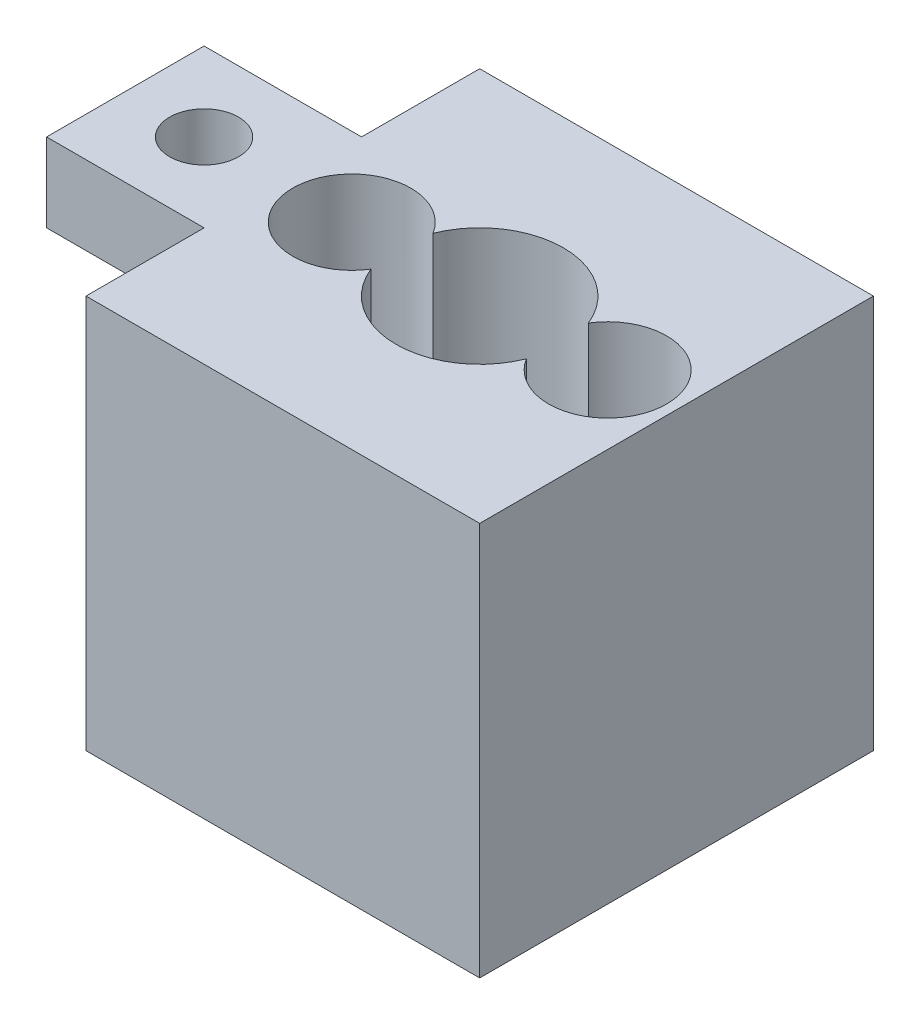
ISO-10303-21;
HEADER;
FILE_DESCRIPTION(('STEP AP214'),'2;1');
FILE_NAME('part.step','',(''),(''),'','','');
FILE_SCHEMA(('AUTOMOTIVE_DESIGN { 1 0 10303 214 1 1 1 1 }'));
ENDSEC;
DATA;
#1=APPLICATION_CONTEXT('core data for automotive mechanical design processes');
#2=APPLICATION_PROTOCOL_DEFINITION('international standard','automotive_design',2000,#1);
#3=PRODUCT_CONTEXT('',#1,'mechanical');
#4=PRODUCT('Part','Part','',(#3));
#5=PRODUCT_RELATED_PRODUCT_CATEGORY('part','',(#4));
#6=PRODUCT_DEFINITION_FORMATION('','',#4);
#7=PRODUCT_DEFINITION_CONTEXT('part definition',#1,'design');
#8=PRODUCT_DEFINITION('design','',#6,#7);
#9=PRODUCT_DEFINITION_SHAPE('','',#8);
#10=(LENGTH_UNIT() NAMED_UNIT(*) SI_UNIT(.MILLI.,.METRE.));
#11=(NAMED_UNIT(*) PLANE_ANGLE_UNIT() SI_UNIT($,.RADIAN.));
#12=(NAMED_UNIT(*) SI_UNIT($,.STERADIAN.) SOLID_ANGLE_UNIT());
#13=UNCERTAINTY_MEASURE_WITH_UNIT(LENGTH_MEASURE(1.E-05),#10,'distance_accuracy_value','');
#14=(GEOMETRIC_REPRESENTATION_CONTEXT(3) GLOBAL_UNCERTAINTY_ASSIGNED_CONTEXT((#13)) GLOBAL_UNIT_ASSIGNED_CONTEXT((#10,
#11,#12)) REPRESENTATION_CONTEXT('',''));
#15=CARTESIAN_POINT('',(0.,0.,0.));
#16=DIRECTION('',(0.,0.,1.));
#17=DIRECTION('',(1.,0.,0.));
#18=AXIS2_PLACEMENT_3D('',#15,#16,#17);
#19=CARTESIAN_POINT('',(-10.,20.,10.));
#20=DIRECTION('',(1.,0.,0.));
#21=DIRECTION('',(0.,0.,-1.));
#22=AXIS2_PLACEMENT_3D('',#19,#20,#21);
#23=PLANE('',#22);
#24=DIRECTION('',(0.,-1.,0.));
#25=VECTOR('',#24,1.);
#26=CARTESIAN_POINT('',(-10.,20.,-4.));
#27=LINE('',#26,#25);
#28=CARTESIAN_POINT('',(-10.,20.,-4.));
#29=VERTEX_POINT('',#28);
#30=CARTESIAN_POINT('',(-10.,16.,-4.));
#31=VERTEX_POINT('',#30);
#32=EDGE_CURVE('E142',#29,#31,#27,.T.);
#33=ORIENTED_EDGE('',*,*,#32,.F.);
#34=DIRECTION('',(0.,0.,1.));
#35=VECTOR('',#34,1.);
#36=CARTESIAN_POINT('',(-10.,20.,10.));
#37=LINE('',#36,#35);
#38=CARTESIAN_POINT('',(-10.,20.,-10.));
#39=VERTEX_POINT('',#38);
#40=EDGE_CURVE('E192',#39,#29,#37,.T.);
#41=ORIENTED_EDGE('',*,*,#40,.F.);
#42=DIRECTION('',(0.,-1.,0.));
#43=VECTOR('',#42,1.);
#44=CARTESIAN_POINT('',(-10.,20.,-10.));
#45=LINE('',#44,#43);
#46=CARTESIAN_POINT('',(-10.,0.,-10.));
#47=VERTEX_POINT('',#46);
#48=EDGE_CURVE('E211',#39,#47,#45,.T.);
#49=ORIENTED_EDGE('',*,*,#48,.T.);
#50=DIRECTION('',(0.,0.,1.));
#51=VECTOR('',#50,1.);
#52=CARTESIAN_POINT('',(-10.,0.,10.));
#53=LINE('',#52,#51);
#54=CARTESIAN_POINT('',(-10.,0.,10.));
#55=VERTEX_POINT('',#54);
#56=EDGE_CURVE('E203',#47,#55,#53,.T.);
#57=ORIENTED_EDGE('',*,*,#56,.T.);
#58=DIRECTION('',(0.,-1.,0.));
#59=VECTOR('',#58,1.);
#60=CARTESIAN_POINT('',(-10.,20.,10.));
#61=LINE('',#60,#59);
#62=CARTESIAN_POINT('',(-10.,20.,10.));
#63=VERTEX_POINT('',#62);
#64=EDGE_CURVE('E208',#63,#55,#61,.T.);
#65=ORIENTED_EDGE('',*,*,#64,.F.);
#66=CARTESIAN_POINT('',(-10.,20.,4.));
#67=VERTEX_POINT('',#66);
#68=EDGE_CURVE('E54',#67,#63,#37,.T.);
#69=ORIENTED_EDGE('',*,*,#68,.F.);
#70=DIRECTION('',(0.,1.,0.));
#71=VECTOR('',#70,1.);
#72=CARTESIAN_POINT('',(-10.,20.,4.));
#73=LINE('',#72,#71);
#74=CARTESIAN_POINT('',(-10.,16.,4.));
#75=VERTEX_POINT('',#74);
#76=EDGE_CURVE('E139',#75,#67,#73,.T.);
#77=ORIENTED_EDGE('',*,*,#76,.F.);
#78=DIRECTION('',(0.,0.,1.));
#79=VECTOR('',#78,1.);
#80=CARTESIAN_POINT('',(-10.,16.,4.));
#81=LINE('',#80,#79);
#82=EDGE_CURVE('E48',#31,#75,#81,.T.);
#83=ORIENTED_EDGE('',*,*,#82,.F.);
#84=EDGE_LOOP('',(#33,#41,#49,#57,#65,#69,#77,#83));
#85=FACE_BOUND('',#84,.T.);
#86=ADVANCED_FACE('F32',(#85),#23,.F.);
#87=CARTESIAN_POINT('',(0.,10.,0.));
#88=DIRECTION('',(0.,1.,0.));
#89=DIRECTION('',(0.,0.,1.));
#90=AXIS2_PLACEMENT_3D('',#87,#88,#89);
#91=CYLINDRICAL_SURFACE('',#90,4.25);
#92=CARTESIAN_POINT('',(0.,10.,0.));
#93=DIRECTION('',(0.,1.,0.));
#94=DIRECTION('',(0.,0.,1.));
#95=AXIS2_PLACEMENT_3D('',#92,#93,#94);
#96=CIRCLE('',#95,4.25);
#97=CARTESIAN_POINT('',(-3.94711538461538,10.,1.57568402306191));
#98=VERTEX_POINT('',#97);
#99=CARTESIAN_POINT('',(3.94711538461539,10.,1.5756840230619));
#100=VERTEX_POINT('',#99);
#101=EDGE_CURVE('E179',#98,#100,#96,.T.);
#102=ORIENTED_EDGE('',*,*,#101,.F.);
#103=DIRECTION('',(0.,1.,0.));
#104=VECTOR('',#103,1.);
#105=CARTESIAN_POINT('',(-3.94711538461539,12.5,1.57568402306191));
#106=LINE('',#105,#104);
#107=CARTESIAN_POINT('',(-3.94711538461538,20.,1.5756840230619));
#108=VERTEX_POINT('',#107);
#109=EDGE_CURVE('E169',#98,#108,#106,.T.);
#110=ORIENTED_EDGE('',*,*,#109,.T.);
#111=CARTESIAN_POINT('',(0.,20.,0.));
#112=DIRECTION('',(0.,1.,0.));
#113=DIRECTION('',(0.,0.,1.));
#114=AXIS2_PLACEMENT_3D('',#111,#112,#113);
#115=CIRCLE('',#114,4.25);
#116=CARTESIAN_POINT('',(3.94711538461539,20.,1.5756840230619));
#117=VERTEX_POINT('',#116);
#118=EDGE_CURVE('E176',#108,#117,#115,.T.);
#119=ORIENTED_EDGE('',*,*,#118,.T.);
#120=DIRECTION('',(0.,1.,0.));
#121=VECTOR('',#120,1.);
#122=CARTESIAN_POINT('',(3.94711538461539,12.5,1.5756840230619));
#123=LINE('',#122,#121);
#124=EDGE_CURVE('E159',#117,#100,#123,.F.);
#125=ORIENTED_EDGE('',*,*,#124,.T.);
#126=EDGE_LOOP('',(#102,#110,#119,#125));
#127=FACE_BOUND('',#126,.T.);
#128=ADVANCED_FACE('F230',(#127),#91,.F.);
#129=CARTESIAN_POINT('',(6.5,0.,0.));
#130=DIRECTION('',(0.,1.,0.));
#131=DIRECTION('',(0.,0.,1.));
#132=AXIS2_PLACEMENT_3D('',#129,#130,#131);
#133=CYLINDRICAL_SURFACE('',#132,1.75);
#134=CARTESIAN_POINT('',(6.5,0.,0.));
#135=DIRECTION('',(0.,1.,0.));
#136=DIRECTION('',(0.,0.,1.));
#137=AXIS2_PLACEMENT_3D('',#134,#135,#136);
#138=CIRCLE('',#137,1.75);
#139=CARTESIAN_POINT('',(6.5,0.,1.75));
#140=VERTEX_POINT('',#139);
#141=EDGE_CURVE('E172',#140,#140,#138,.T.);
#142=ORIENTED_EDGE('',*,*,#141,.F.);
#143=EDGE_LOOP('',(#142));
#144=FACE_BOUND('',#143,.T.);
#145=CARTESIAN_POINT('',(6.5,4.99999999999999,0.));
#146=DIRECTION('',(0.,1.,0.));
#147=DIRECTION('',(0.,0.,1.));
#148=AXIS2_PLACEMENT_3D('',#145,#146,#147);
#149=CIRCLE('',#148,1.75);
#150=CARTESIAN_POINT('',(6.5,4.99999999999999,1.75));
#151=VERTEX_POINT('',#150);
#152=EDGE_CURVE('E163',#151,#151,#149,.F.);
#153=ORIENTED_EDGE('',*,*,#152,.F.);
#154=EDGE_LOOP('',(#153));
#155=FACE_BOUND('',#154,.T.);
#156=ADVANCED_FACE('F290',(#144,#155),#133,.F.);
#157=CARTESIAN_POINT('',(-6.5,0.,0.));
#158=DIRECTION('',(0.,1.,0.));
#159=DIRECTION('',(0.,0.,1.));
#160=AXIS2_PLACEMENT_3D('',#157,#158,#159);
#161=CYLINDRICAL_SURFACE('',#160,1.75);
#162=CARTESIAN_POINT('',(-6.5,0.,0.));
#163=DIRECTION('',(0.,1.,0.));
#164=DIRECTION('',(0.,0.,1.));
#165=AXIS2_PLACEMENT_3D('',#162,#163,#164);
#166=CIRCLE('',#165,1.75);
#167=CARTESIAN_POINT('',(-6.5,0.,1.75));
#168=VERTEX_POINT('',#167);
#169=EDGE_CURVE('E173',#168,#168,#166,.T.);
#170=ORIENTED_EDGE('',*,*,#169,.F.);
#171=EDGE_LOOP('',(#170));
#172=FACE_BOUND('',#171,.T.);
#173=CARTESIAN_POINT('',(-6.5,4.99999999999999,0.));
#174=DIRECTION('',(0.,1.,0.));
#175=DIRECTION('',(0.,0.,1.));
#176=AXIS2_PLACEMENT_3D('',#173,#174,#175);
#177=CIRCLE('',#176,1.75);
#178=CARTESIAN_POINT('',(-6.5,4.99999999999999,1.75));
#179=VERTEX_POINT('',#178);
#180=EDGE_CURVE('E154',#179,#179,#177,.F.);
#181=ORIENTED_EDGE('',*,*,#180,.F.);
#182=EDGE_LOOP('',(#181));
#183=FACE_BOUND('',#182,.T.);
#184=ADVANCED_FACE('F300',(#172,#183),#161,.F.);
#185=CARTESIAN_POINT('',(10.,20.,10.));
#186=DIRECTION('',(-1.,0.,0.));
#187=DIRECTION('',(0.,0.,1.));
#188=AXIS2_PLACEMENT_3D('',#185,#186,#187);
#189=PLANE('',#188);
#190=DIRECTION('',(0.,0.,-1.));
#191=VECTOR('',#190,1.);
#192=CARTESIAN_POINT('',(10.,0.,10.));
#193=LINE('',#192,#191);
#194=CARTESIAN_POINT('',(10.,0.,10.));
#195=VERTEX_POINT('',#194);
#196=CARTESIAN_POINT('',(10.,0.,-10.));
#197=VERTEX_POINT('',#196);
#198=EDGE_CURVE('E198',#195,#197,#193,.T.);
#199=ORIENTED_EDGE('',*,*,#198,.T.);
#200=DIRECTION('',(0.,-1.,0.));
#201=VECTOR('',#200,1.);
#202=CARTESIAN_POINT('',(10.,20.,-10.));
#203=LINE('',#202,#201);
#204=CARTESIAN_POINT('',(10.,20.,-10.));
#205=VERTEX_POINT('',#204);
#206=EDGE_CURVE('E214',#205,#197,#203,.T.);
#207=ORIENTED_EDGE('',*,*,#206,.F.);
#208=DIRECTION('',(0.,0.,-1.));
#209=VECTOR('',#208,1.);
#210=CARTESIAN_POINT('',(10.,20.,10.));
#211=LINE('',#210,#209);
#212=CARTESIAN_POINT('',(10.,20.,10.));
#213=VERTEX_POINT('',#212);
#214=EDGE_CURVE('E186',#213,#205,#211,.T.);
#215=ORIENTED_EDGE('',*,*,#214,.F.);
#216=DIRECTION('',(0.,-1.,0.));
#217=VECTOR('',#216,1.);
#218=CARTESIAN_POINT('',(10.,20.,10.));
#219=LINE('',#218,#217);
#220=EDGE_CURVE('E197',#213,#195,#219,.T.);
#221=ORIENTED_EDGE('',*,*,#220,.T.);
#222=EDGE_LOOP('',(#199,#207,#215,#221));
#223=FACE_BOUND('',#222,.T.);
#224=ADVANCED_FACE('F34',(#223),#189,.F.);
#225=CARTESIAN_POINT('',(-10.,20.,-10.));
#226=DIRECTION('',(0.,0.,1.));
#227=DIRECTION('',(1.,0.,0.));
#228=AXIS2_PLACEMENT_3D('',#225,#226,#227);
#229=PLANE('',#228);
#230=DIRECTION('',(-1.,0.,0.));
#231=VECTOR('',#230,1.);
#232=CARTESIAN_POINT('',(-10.,0.,-10.));
#233=LINE('',#232,#231);
#234=EDGE_CURVE('E201',#197,#47,#233,.T.);
#235=ORIENTED_EDGE('',*,*,#234,.T.);
#236=ORIENTED_EDGE('',*,*,#48,.F.);
#237=DIRECTION('',(-1.,0.,0.));
#238=VECTOR('',#237,1.);
#239=CARTESIAN_POINT('',(-10.,20.,-10.));
#240=LINE('',#239,#238);
#241=EDGE_CURVE('E189',#205,#39,#240,.T.);
#242=ORIENTED_EDGE('',*,*,#241,.F.);
#243=ORIENTED_EDGE('',*,*,#206,.T.);
#244=EDGE_LOOP('',(#235,#236,#242,#243));
#245=FACE_BOUND('',#244,.T.);
#246=ADVANCED_FACE('F257',(#245),#229,.F.);
#247=CARTESIAN_POINT('',(-10.,20.,10.));
#248=DIRECTION('',(0.,0.,-1.));
#249=DIRECTION('',(-1.,0.,0.));
#250=AXIS2_PLACEMENT_3D('',#247,#248,#249);
#251=PLANE('',#250);
#252=DIRECTION('',(1.,0.,0.));
#253=VECTOR('',#252,1.);
#254=CARTESIAN_POINT('',(-10.,0.,10.));
#255=LINE('',#254,#253);
#256=EDGE_CURVE('E190',#55,#195,#255,.T.);
#257=ORIENTED_EDGE('',*,*,#256,.T.);
#258=ORIENTED_EDGE('',*,*,#220,.F.);
#259=DIRECTION('',(1.,0.,0.));
#260=VECTOR('',#259,1.);
#261=CARTESIAN_POINT('',(-10.,20.,10.));
#262=LINE('',#261,#260);
#263=EDGE_CURVE('E195',#63,#213,#262,.T.);
#264=ORIENTED_EDGE('',*,*,#263,.F.);
#265=ORIENTED_EDGE('',*,*,#64,.T.);
#266=EDGE_LOOP('',(#257,#258,#264,#265));
#267=FACE_BOUND('',#266,.T.);
#268=ADVANCED_FACE('F246',(#267),#251,.F.);
#269=CARTESIAN_POINT('',(0.,20.,0.));
#270=DIRECTION('',(0.,-1.,0.));
#271=DIRECTION('',(0.,0.,-1.));
#272=AXIS2_PLACEMENT_3D('',#269,#270,#271);
#273=PLANE('',#272);
#274=CARTESIAN_POINT('',(-14.,20.,0.));
#275=DIRECTION('',(0.,-1.,0.));
#276=DIRECTION('',(0.,0.,-1.));
#277=AXIS2_PLACEMENT_3D('',#274,#275,#276);
#278=CIRCLE('',#277,1.75);
#279=CARTESIAN_POINT('',(-14.,20.,-1.75));
#280=VERTEX_POINT('',#279);
#281=EDGE_CURVE('E269',#280,#280,#278,.T.);
#282=ORIENTED_EDGE('',*,*,#281,.T.);
#283=EDGE_LOOP('',(#282));
#284=FACE_BOUND('',#283,.T.);
#285=ORIENTED_EDGE('',*,*,#118,.F.);
#286=CARTESIAN_POINT('',(-6.5,20.,0.));
#287=DIRECTION('',(0.,1.,0.));
#288=DIRECTION('',(0.,0.,1.));
#289=AXIS2_PLACEMENT_3D('',#286,#287,#288);
#290=CIRCLE('',#289,3.);
#291=CARTESIAN_POINT('',(-3.94711538461538,20.,-1.5756840230619));
#292=VERTEX_POINT('',#291);
#293=EDGE_CURVE('E155',#292,#108,#290,.T.);
#294=ORIENTED_EDGE('',*,*,#293,.F.);
#295=CARTESIAN_POINT('',(3.94711538461539,20.,-1.5756840230619));
#296=VERTEX_POINT('',#295);
#297=EDGE_CURVE('E183',#296,#292,#115,.T.);
#298=ORIENTED_EDGE('',*,*,#297,.F.);
#299=CARTESIAN_POINT('',(6.5,20.,0.));
#300=DIRECTION('',(0.,1.,0.));
#301=DIRECTION('',(0.,0.,1.));
#302=AXIS2_PLACEMENT_3D('',#299,#300,#301);
#303=CIRCLE('',#302,3.);
#304=EDGE_CURVE('E143',#117,#296,#303,.T.);
#305=ORIENTED_EDGE('',*,*,#304,.F.);
#306=EDGE_LOOP('',(#285,#294,#298,#305));
#307=FACE_BOUND('',#306,.T.);
#308=ORIENTED_EDGE('',*,*,#214,.T.);
#309=ORIENTED_EDGE('',*,*,#241,.T.);
#310=ORIENTED_EDGE('',*,*,#40,.T.);
#311=DIRECTION('',(1.,0.,0.));
#312=VECTOR('',#311,1.);
#313=CARTESIAN_POINT('',(-18.,20.,-4.));
#314=LINE('',#313,#312);
#315=CARTESIAN_POINT('',(-18.,20.,-4.));
#316=VERTEX_POINT('',#315);
#317=EDGE_CURVE('E260',#316,#29,#314,.T.);
#318=ORIENTED_EDGE('',*,*,#317,.F.);
#319=DIRECTION('',(0.,0.,-1.));
#320=VECTOR('',#319,1.);
#321=CARTESIAN_POINT('',(-18.,20.,4.));
#322=LINE('',#321,#320);
#323=CARTESIAN_POINT('',(-18.,20.,4.));
#324=VERTEX_POINT('',#323);
#325=EDGE_CURVE('E135',#324,#316,#322,.T.);
#326=ORIENTED_EDGE('',*,*,#325,.F.);
#327=DIRECTION('',(1.,0.,0.));
#328=VECTOR('',#327,1.);
#329=CARTESIAN_POINT('',(-18.,20.,4.));
#330=LINE('',#329,#328);
#331=EDGE_CURVE('E147',#324,#67,#330,.T.);
#332=ORIENTED_EDGE('',*,*,#331,.T.);
#333=ORIENTED_EDGE('',*,*,#68,.T.);
#334=ORIENTED_EDGE('',*,*,#263,.T.);
#335=EDGE_LOOP('',(#308,#309,#310,#318,#326,#332,#333,#334));
#336=FACE_BOUND('',#335,.T.);
#337=ADVANCED_FACE('F242',(#284,#307,#336),#273,.F.);
#338=CARTESIAN_POINT('',(0.,0.,0.));
#339=DIRECTION('',(0.,-1.,0.));
#340=DIRECTION('',(0.,0.,-1.));
#341=AXIS2_PLACEMENT_3D('',#338,#339,#340);
#342=PLANE('',#341);
#343=ORIENTED_EDGE('',*,*,#169,.T.);
#344=EDGE_LOOP('',(#343));
#345=FACE_BOUND('',#344,.T.);
#346=ORIENTED_EDGE('',*,*,#141,.T.);
#347=EDGE_LOOP('',(#346));
#348=FACE_BOUND('',#347,.T.);
#349=ORIENTED_EDGE('',*,*,#198,.F.);
#350=ORIENTED_EDGE('',*,*,#256,.F.);
#351=ORIENTED_EDGE('',*,*,#56,.F.);
#352=ORIENTED_EDGE('',*,*,#234,.F.);
#353=EDGE_LOOP('',(#349,#350,#351,#352));
#354=FACE_BOUND('',#353,.T.);
#355=ADVANCED_FACE('F245',(#345,#348,#354),#342,.T.);
#356=ORIENTED_EDGE('',*,*,#297,.T.);
#357=DIRECTION('',(0.,1.,0.));
#358=VECTOR('',#357,1.);
#359=CARTESIAN_POINT('',(-3.94711538461539,12.5,-1.57568402306191));
#360=LINE('',#359,#358);
#361=CARTESIAN_POINT('',(-3.94711538461538,10.,-1.57568402306191));
#362=VERTEX_POINT('',#361);
#363=EDGE_CURVE('E166',#292,#362,#360,.F.);
#364=ORIENTED_EDGE('',*,*,#363,.T.);
#365=CARTESIAN_POINT('',(3.94711538461539,10.,-1.5756840230619));
#366=VERTEX_POINT('',#365);
#367=EDGE_CURVE('E182',#366,#362,#96,.T.);
#368=ORIENTED_EDGE('',*,*,#367,.F.);
#369=DIRECTION('',(0.,1.,0.));
#370=VECTOR('',#369,1.);
#371=CARTESIAN_POINT('',(3.94711538461539,12.5,-1.5756840230619));
#372=LINE('',#371,#370);
#373=EDGE_CURVE('E162',#366,#296,#372,.T.);
#374=ORIENTED_EDGE('',*,*,#373,.T.);
#375=EDGE_LOOP('',(#356,#364,#368,#374));
#376=FACE_BOUND('',#375,.T.);
#377=ADVANCED_FACE('F239',(#376),#91,.F.);
#378=CARTESIAN_POINT('',(0.,10.,0.));
#379=DIRECTION('',(0.,1.,0.));
#380=DIRECTION('',(0.,0.,1.));
#381=AXIS2_PLACEMENT_3D('',#378,#379,#380);
#382=PLANE('',#381);
#383=CARTESIAN_POINT('',(-6.5,10.,0.));
#384=DIRECTION('',(0.,1.,0.));
#385=DIRECTION('',(0.,0.,1.));
#386=AXIS2_PLACEMENT_3D('',#383,#384,#385);
#387=CIRCLE('',#386,3.);
#388=EDGE_CURVE('E11',#98,#362,#387,.T.);
#389=ORIENTED_EDGE('',*,*,#388,.F.);
#390=ORIENTED_EDGE('',*,*,#101,.T.);
#391=CARTESIAN_POINT('',(6.5,10.,0.));
#392=DIRECTION('',(0.,1.,0.));
#393=DIRECTION('',(0.,0.,1.));
#394=AXIS2_PLACEMENT_3D('',#391,#392,#393);
#395=CIRCLE('',#394,3.);
#396=EDGE_CURVE('E41',#366,#100,#395,.T.);
#397=ORIENTED_EDGE('',*,*,#396,.F.);
#398=ORIENTED_EDGE('',*,*,#367,.T.);
#399=EDGE_LOOP('',(#389,#390,#397,#398));
#400=FACE_BOUND('',#399,.T.);
#401=ADVANCED_FACE('F233',(#400),#382,.T.);
#402=CARTESIAN_POINT('',(-6.5,4.99999999999999,0.));
#403=DIRECTION('',(0.,1.,0.));
#404=DIRECTION('',(0.,0.,1.));
#405=AXIS2_PLACEMENT_3D('',#402,#403,#404);
#406=CYLINDRICAL_SURFACE('',#405,3.);
#407=CARTESIAN_POINT('',(-6.5,4.99999999999999,0.));
#408=DIRECTION('',(0.,1.,0.));
#409=DIRECTION('',(0.,0.,1.));
#410=AXIS2_PLACEMENT_3D('',#407,#408,#409);
#411=CIRCLE('',#410,3.);
#412=CARTESIAN_POINT('',(-6.5,4.99999999999999,3.));
#413=VERTEX_POINT('',#412);
#414=EDGE_CURVE('E151',#413,#413,#411,.T.);
#415=ORIENTED_EDGE('',*,*,#414,.F.);
#416=EDGE_LOOP('',(#415));
#417=FACE_BOUND('',#416,.T.);
#418=ORIENTED_EDGE('',*,*,#388,.T.);
#419=ORIENTED_EDGE('',*,*,#363,.F.);
#420=ORIENTED_EDGE('',*,*,#293,.T.);
#421=ORIENTED_EDGE('',*,*,#109,.F.);
#422=EDGE_LOOP('',(#418,#419,#420,#421));
#423=FACE_BOUND('',#422,.T.);
#424=ADVANCED_FACE('F235',(#417,#423),#406,.F.);
#425=CARTESIAN_POINT('',(-6.5,4.99999999999999,0.));
#426=DIRECTION('',(0.,1.,0.));
#427=DIRECTION('',(0.,0.,1.));
#428=AXIS2_PLACEMENT_3D('',#425,#426,#427);
#429=PLANE('',#428);
#430=ORIENTED_EDGE('',*,*,#414,.T.);
#431=EDGE_LOOP('',(#430));
#432=FACE_BOUND('',#431,.T.);
#433=ORIENTED_EDGE('',*,*,#180,.T.);
#434=EDGE_LOOP('',(#433));
#435=FACE_BOUND('',#434,.T.);
#436=ADVANCED_FACE('F337',(#432,#435),#429,.T.);
#437=CARTESIAN_POINT('',(6.5,4.99999999999999,0.));
#438=DIRECTION('',(0.,1.,0.));
#439=DIRECTION('',(0.,0.,1.));
#440=AXIS2_PLACEMENT_3D('',#437,#438,#439);
#441=CYLINDRICAL_SURFACE('',#440,3.);
#442=CARTESIAN_POINT('',(6.5,4.99999999999999,0.));
#443=DIRECTION('',(0.,1.,0.));
#444=DIRECTION('',(0.,0.,1.));
#445=AXIS2_PLACEMENT_3D('',#442,#443,#444);
#446=CIRCLE('',#445,3.);
#447=CARTESIAN_POINT('',(6.5,4.99999999999999,3.));
#448=VERTEX_POINT('',#447);
#449=EDGE_CURVE('E145',#448,#448,#446,.T.);
#450=ORIENTED_EDGE('',*,*,#449,.F.);
#451=EDGE_LOOP('',(#450));
#452=FACE_BOUND('',#451,.T.);
#453=ORIENTED_EDGE('',*,*,#396,.T.);
#454=ORIENTED_EDGE('',*,*,#124,.F.);
#455=ORIENTED_EDGE('',*,*,#304,.T.);
#456=ORIENTED_EDGE('',*,*,#373,.F.);
#457=EDGE_LOOP('',(#453,#454,#455,#456));
#458=FACE_BOUND('',#457,.T.);
#459=ADVANCED_FACE('F223',(#452,#458),#441,.F.);
#460=CARTESIAN_POINT('',(6.5,4.99999999999999,0.));
#461=DIRECTION('',(0.,1.,0.));
#462=DIRECTION('',(0.,0.,1.));
#463=AXIS2_PLACEMENT_3D('',#460,#461,#462);
#464=PLANE('',#463);
#465=ORIENTED_EDGE('',*,*,#449,.T.);
#466=EDGE_LOOP('',(#465));
#467=FACE_BOUND('',#466,.T.);
#468=ORIENTED_EDGE('',*,*,#152,.T.);
#469=EDGE_LOOP('',(#468));
#470=FACE_BOUND('',#469,.T.);
#471=ADVANCED_FACE('F329',(#467,#470),#464,.T.);
#472=CARTESIAN_POINT('',(-18.,20.,-4.));
#473=DIRECTION('',(0.,0.,1.));
#474=DIRECTION('',(0.,-1.,0.));
#475=AXIS2_PLACEMENT_3D('',#472,#473,#474);
#476=PLANE('',#475);
#477=ORIENTED_EDGE('',*,*,#32,.T.);
#478=DIRECTION('',(1.,0.,0.));
#479=VECTOR('',#478,1.);
#480=CARTESIAN_POINT('',(-18.,16.,-4.));
#481=LINE('',#480,#479);
#482=CARTESIAN_POINT('',(-18.,16.,-4.));
#483=VERTEX_POINT('',#482);
#484=EDGE_CURVE('E123',#483,#31,#481,.T.);
#485=ORIENTED_EDGE('',*,*,#484,.F.);
#486=DIRECTION('',(0.,-1.,0.));
#487=VECTOR('',#486,1.);
#488=CARTESIAN_POINT('',(-18.,20.,-4.));
#489=LINE('',#488,#487);
#490=EDGE_CURVE('E130',#316,#483,#489,.T.);
#491=ORIENTED_EDGE('',*,*,#490,.F.);
#492=ORIENTED_EDGE('',*,*,#317,.T.);
#493=EDGE_LOOP('',(#477,#485,#491,#492));
#494=FACE_BOUND('',#493,.T.);
#495=ADVANCED_FACE('F141',(#494),#476,.F.);
#496=CARTESIAN_POINT('',(-18.,16.,4.));
#497=DIRECTION('',(0.,1.,0.));
#498=DIRECTION('',(0.,0.,1.));
#499=AXIS2_PLACEMENT_3D('',#496,#497,#498);
#500=PLANE('',#499);
#501=CARTESIAN_POINT('',(-14.,16.,0.));
#502=DIRECTION('',(0.,1.,0.));
#503=DIRECTION('',(0.,0.,1.));
#504=AXIS2_PLACEMENT_3D('',#501,#502,#503);
#505=CIRCLE('',#504,1.75);
#506=CARTESIAN_POINT('',(-14.,16.,1.75));
#507=VERTEX_POINT('',#506);
#508=EDGE_CURVE('E36',#507,#507,#505,.T.);
#509=ORIENTED_EDGE('',*,*,#508,.T.);
#510=EDGE_LOOP('',(#509));
#511=FACE_BOUND('',#510,.T.);
#512=ORIENTED_EDGE('',*,*,#82,.T.);
#513=DIRECTION('',(1.,0.,0.));
#514=VECTOR('',#513,1.);
#515=CARTESIAN_POINT('',(-18.,16.,4.));
#516=LINE('',#515,#514);
#517=CARTESIAN_POINT('',(-18.,16.,4.));
#518=VERTEX_POINT('',#517);
#519=EDGE_CURVE('E126',#518,#75,#516,.T.);
#520=ORIENTED_EDGE('',*,*,#519,.F.);
#521=DIRECTION('',(0.,0.,1.));
#522=VECTOR('',#521,1.);
#523=CARTESIAN_POINT('',(-18.,16.,4.));
#524=LINE('',#523,#522);
#525=EDGE_CURVE('E119',#483,#518,#524,.T.);
#526=ORIENTED_EDGE('',*,*,#525,.F.);
#527=ORIENTED_EDGE('',*,*,#484,.T.);
#528=EDGE_LOOP('',(#512,#520,#526,#527));
#529=FACE_BOUND('',#528,.T.);
#530=ADVANCED_FACE('F121',(#511,#529),#500,.F.);
#531=CARTESIAN_POINT('',(-18.,20.,4.));
#532=DIRECTION('',(0.,0.,-1.));
#533=DIRECTION('',(0.,1.,0.));
#534=AXIS2_PLACEMENT_3D('',#531,#532,#533);
#535=PLANE('',#534);
#536=ORIENTED_EDGE('',*,*,#76,.T.);
#537=ORIENTED_EDGE('',*,*,#331,.F.);
#538=DIRECTION('',(0.,1.,0.));
#539=VECTOR('',#538,1.);
#540=CARTESIAN_POINT('',(-18.,20.,4.));
#541=LINE('',#540,#539);
#542=EDGE_CURVE('E129',#518,#324,#541,.T.);
#543=ORIENTED_EDGE('',*,*,#542,.F.);
#544=ORIENTED_EDGE('',*,*,#519,.T.);
#545=EDGE_LOOP('',(#536,#537,#543,#544));
#546=FACE_BOUND('',#545,.T.);
#547=ADVANCED_FACE('F283',(#546),#535,.F.);
#548=CARTESIAN_POINT('',(-18.,0.,0.));
#549=DIRECTION('',(1.,0.,0.));
#550=DIRECTION('',(0.,0.,-1.));
#551=AXIS2_PLACEMENT_3D('',#548,#549,#550);
#552=PLANE('',#551);
#553=ORIENTED_EDGE('',*,*,#490,.T.);
#554=ORIENTED_EDGE('',*,*,#525,.T.);
#555=ORIENTED_EDGE('',*,*,#542,.T.);
#556=ORIENTED_EDGE('',*,*,#325,.T.);
#557=EDGE_LOOP('',(#553,#554,#555,#556));
#558=FACE_BOUND('',#557,.T.);
#559=ADVANCED_FACE('F133',(#558),#552,.F.);
#560=CARTESIAN_POINT('',(-14.,20.,0.));
#561=DIRECTION('',(0.,-1.,0.));
#562=DIRECTION('',(0.,0.,-1.));
#563=AXIS2_PLACEMENT_3D('',#560,#561,#562);
#564=CYLINDRICAL_SURFACE('',#563,1.75);
#565=ORIENTED_EDGE('',*,*,#281,.F.);
#566=EDGE_LOOP('',(#565));
#567=FACE_BOUND('',#566,.T.);
#568=ORIENTED_EDGE('',*,*,#508,.F.);
#569=EDGE_LOOP('',(#568));
#570=FACE_BOUND('',#569,.T.);
#571=ADVANCED_FACE('F276',(#567,#570),#564,.F.);
#572=CLOSED_SHELL('',(#86,#128,#156,#184,#224,#246,#268,#337,#355,#377,#401,#424,#436,#459,#471,
#495,#530,#547,#559,#571));
#573=MANIFOLD_SOLID_BREP('B2',#572);
#574=ADVANCED_BREP_SHAPE_REPRESENTATION('',(#18,#573),#14);
#575=SHAPE_DEFINITION_REPRESENTATION(#9,#574);
ENDSEC;
END-ISO-10303-21;
